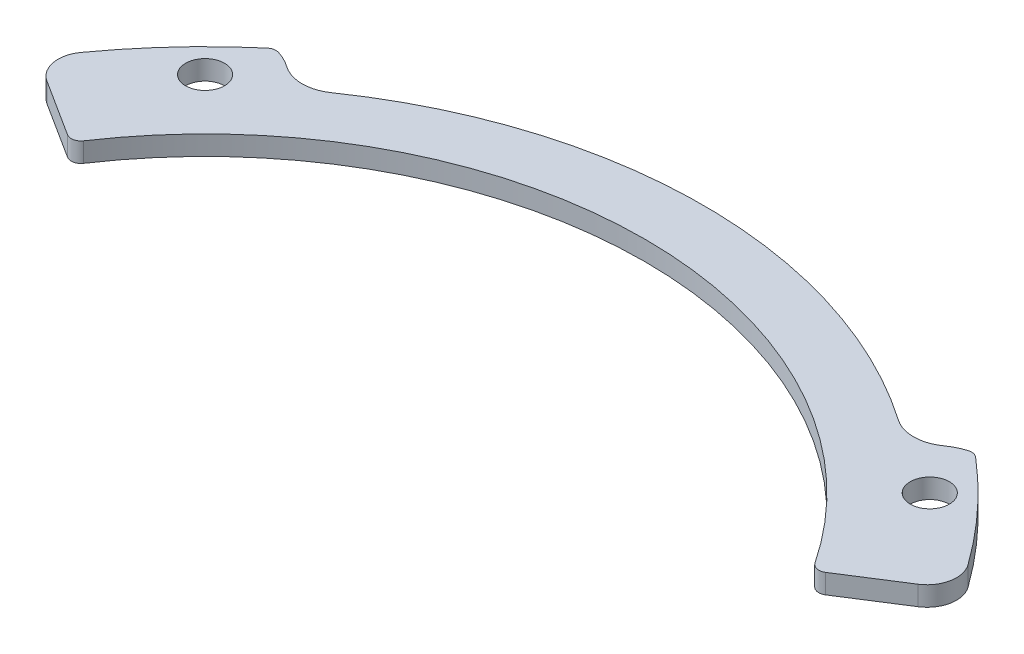
ISO-10303-21;
HEADER;
FILE_DESCRIPTION(('STEP AP214'),'2;1');
FILE_NAME('part.step','',(''),(''),'','','');
FILE_SCHEMA(('AUTOMOTIVE_DESIGN { 1 0 10303 214 1 1 1 1 }'));
ENDSEC;
DATA;
#1=APPLICATION_CONTEXT('core data for automotive mechanical design processes');
#2=APPLICATION_PROTOCOL_DEFINITION('international standard','automotive_design',2000,#1);
#3=PRODUCT_CONTEXT('',#1,'mechanical');
#4=PRODUCT('Part','Part','',(#3));
#5=PRODUCT_RELATED_PRODUCT_CATEGORY('part','',(#4));
#6=PRODUCT_DEFINITION_FORMATION('','',#4);
#7=PRODUCT_DEFINITION_CONTEXT('part definition',#1,'design');
#8=PRODUCT_DEFINITION('design','',#6,#7);
#9=PRODUCT_DEFINITION_SHAPE('','',#8);
#10=(LENGTH_UNIT() NAMED_UNIT(*) SI_UNIT(.MILLI.,.METRE.));
#11=(NAMED_UNIT(*) PLANE_ANGLE_UNIT() SI_UNIT($,.RADIAN.));
#12=(NAMED_UNIT(*) SI_UNIT($,.STERADIAN.) SOLID_ANGLE_UNIT());
#13=UNCERTAINTY_MEASURE_WITH_UNIT(LENGTH_MEASURE(1.E-05),#10,'distance_accuracy_value','');
#14=(GEOMETRIC_REPRESENTATION_CONTEXT(3) GLOBAL_UNCERTAINTY_ASSIGNED_CONTEXT((#13)) GLOBAL_UNIT_ASSIGNED_CONTEXT((#10,
#11,#12)) REPRESENTATION_CONTEXT('',''));
#15=CARTESIAN_POINT('',(0.,0.,0.));
#16=DIRECTION('',(0.,0.,1.));
#17=DIRECTION('',(1.,0.,0.));
#18=AXIS2_PLACEMENT_3D('',#15,#16,#17);
#19=CARTESIAN_POINT('',(0.,2.,0.));
#20=DIRECTION('',(0.,1.,0.));
#21=DIRECTION('',(0.,0.,1.));
#22=AXIS2_PLACEMENT_3D('',#19,#20,#21);
#23=PLANE('',#22);
#24=CARTESIAN_POINT('',(-37.1231060122938,2.,-37.1231060122937));
#25=DIRECTION('',(0.,1.,0.));
#26=DIRECTION('',(0.,0.,1.));
#27=AXIS2_PLACEMENT_3D('',#24,#25,#26);
#28=CIRCLE('',#27,2.);
#29=CARTESIAN_POINT('',(-37.1231060122938,2.,-35.1231060122937));
#30=VERTEX_POINT('',#29);
#31=EDGE_CURVE('E204',#30,#30,#28,.T.);
#32=ORIENTED_EDGE('',*,*,#31,.F.);
#33=EDGE_LOOP('',(#32));
#34=FACE_BOUND('',#33,.T.);
#35=CARTESIAN_POINT('',(37.1231060122937,2.,-37.1231060122937));
#36=DIRECTION('',(0.,1.,0.));
#37=DIRECTION('',(0.,0.,1.));
#38=AXIS2_PLACEMENT_3D('',#35,#36,#37);
#39=CIRCLE('',#38,2.00000000000001);
#40=CARTESIAN_POINT('',(37.1231060122937,2.,-35.1231060122937));
#41=VERTEX_POINT('',#40);
#42=EDGE_CURVE('E210',#41,#41,#39,.T.);
#43=ORIENTED_EDGE('',*,*,#42,.F.);
#44=EDGE_LOOP('',(#43));
#45=FACE_BOUND('',#44,.T.);
#46=CARTESIAN_POINT('',(0.,2.,0.));
#47=DIRECTION('',(0.,-1.,0.));
#48=DIRECTION('',(0.,0.,1.));
#49=AXIS2_PLACEMENT_3D('',#46,#47,#48);
#50=CIRCLE('',#49,45.05);
#51=CARTESIAN_POINT('',(-37.460193224961,2.,-25.0247162531083));
#52=VERTEX_POINT('',#51);
#53=CARTESIAN_POINT('',(37.460193224961,2.,-25.0247162531083));
#54=VERTEX_POINT('',#53);
#55=EDGE_CURVE('E216',#52,#54,#50,.T.);
#56=ORIENTED_EDGE('',*,*,#55,.T.);
#57=CARTESIAN_POINT('',(38.2917180468247,2.,-25.5802038502916));
#58=DIRECTION('',(0.,1.,0.));
#59=DIRECTION('',(0.,0.,1.));
#60=AXIS2_PLACEMENT_3D('',#57,#58,#59);
#61=CIRCLE('',#60,1.);
#62=CARTESIAN_POINT('',(38.8290176551716,2.,-24.7368124044788));
#63=VERTEX_POINT('',#62);
#64=EDGE_CURVE('E277',#54,#63,#61,.T.);
#65=ORIENTED_EDGE('',*,*,#64,.T.);
#66=DIRECTION('',(0.843391445812887,0.,-0.537299608346822));
#67=VECTOR('',#66,1.);
#68=CARTESIAN_POINT('',(37.9947846338706,2.,-24.2053473560243));
#69=LINE('',#68,#67);
#70=CARTESIAN_POINT('',(44.6280804700021,2.,-28.4312228643619));
#71=VERTEX_POINT('',#70);
#72=EDGE_CURVE('E219',#63,#71,#69,.T.);
#73=ORIENTED_EDGE('',*,*,#72,.T.);
#74=CARTESIAN_POINT('',(43.0161816449617,2.,-30.9613972018006));
#75=DIRECTION('',(0.,1.,0.));
#76=DIRECTION('',(0.,0.,1.));
#77=AXIS2_PLACEMENT_3D('',#74,#75,#76);
#78=CIRCLE('',#77,3.00000000000001);
#79=CARTESIAN_POINT('',(45.4510598512803,2.,-32.7139291188836));
#80=VERTEX_POINT('',#79);
#81=EDGE_CURVE('E222',#71,#80,#78,.T.);
#82=ORIENTED_EDGE('',*,*,#81,.T.);
#83=CARTESIAN_POINT('',(0.,2.,0.));
#84=DIRECTION('',(0.,1.,0.));
#85=DIRECTION('',(0.,0.,1.));
#86=AXIS2_PLACEMENT_3D('',#83,#84,#85);
#87=CIRCLE('',#86,56.);
#88=CARTESIAN_POINT('',(36.2811098013673,2.,-42.6577199529128));
#89=VERTEX_POINT('',#88);
#90=EDGE_CURVE('E225',#80,#89,#87,.T.);
#91=ORIENTED_EDGE('',*,*,#90,.T.);
#92=CARTESIAN_POINT('',(35.6332328406286,2.,-41.8959749537536));
#93=DIRECTION('',(0.,1.,0.));
#94=DIRECTION('',(0.,0.,1.));
#95=AXIS2_PLACEMENT_3D('',#92,#93,#94);
#96=CIRCLE('',#95,1.);
#97=CARTESIAN_POINT('',(35.3352582062955,2.,-42.8505487420456));
#98=VERTEX_POINT('',#97);
#99=EDGE_CURVE('E50',#89,#98,#96,.T.);
#100=ORIENTED_EDGE('',*,*,#99,.T.);
#101=CARTESIAN_POINT('',(37.1231060122938,2.,-37.1231060122937));
#102=DIRECTION('',(0.,-1.,0.));
#103=DIRECTION('',(0.,0.,-1.));
#104=AXIS2_PLACEMENT_3D('',#101,#102,#103);
#105=CIRCLE('',#104,6.);
#106=CARTESIAN_POINT('',(33.6433828927082,2.,-42.0110019820359));
#107=VERTEX_POINT('',#106);
#108=EDGE_CURVE('E163',#107,#98,#105,.T.);
#109=ORIENTED_EDGE('',*,*,#108,.F.);
#110=CARTESIAN_POINT('',(31.3235674796512,2.,-45.2695992951974));
#111=DIRECTION('',(0.,1.,0.));
#112=DIRECTION('',(0.,0.,1.));
#113=AXIS2_PLACEMENT_3D('',#110,#111,#112);
#114=CIRCLE('',#113,4.);
#115=CARTESIAN_POINT('',(29.0475589434368,2.,-41.9802551138933));
#116=VERTEX_POINT('',#115);
#117=EDGE_CURVE('E193',#116,#107,#114,.T.);
#118=ORIENTED_EDGE('',*,*,#117,.F.);
#119=CARTESIAN_POINT('',(0.,2.,0.));
#120=DIRECTION('',(0.,-1.,0.));
#121=DIRECTION('',(0.,0.,-1.));
#122=AXIS2_PLACEMENT_3D('',#119,#120,#121);
#123=CIRCLE('',#122,51.05);
#124=CARTESIAN_POINT('',(-29.0475589434368,2.,-41.9802551138933));
#125=VERTEX_POINT('',#124);
#126=EDGE_CURVE('E190',#125,#116,#123,.T.);
#127=ORIENTED_EDGE('',*,*,#126,.F.);
#128=CARTESIAN_POINT('',(-31.3235674796512,2.,-45.2695992951974));
#129=DIRECTION('',(0.,1.,0.));
#130=DIRECTION('',(0.,0.,-1.));
#131=AXIS2_PLACEMENT_3D('',#128,#129,#130);
#132=CIRCLE('',#131,4.);
#133=CARTESIAN_POINT('',(-33.6433828927082,2.,-42.0110019820359));
#134=VERTEX_POINT('',#133);
#135=EDGE_CURVE('E188',#134,#125,#132,.T.);
#136=ORIENTED_EDGE('',*,*,#135,.F.);
#137=CARTESIAN_POINT('',(-37.1231060122938,2.,-37.1231060122937));
#138=DIRECTION('',(0.,-1.,0.));
#139=DIRECTION('',(0.,0.,1.));
#140=AXIS2_PLACEMENT_3D('',#137,#138,#139);
#141=CIRCLE('',#140,6.);
#142=CARTESIAN_POINT('',(-35.3352582062955,2.,-42.8505487420456));
#143=VERTEX_POINT('',#142);
#144=EDGE_CURVE('E169',#143,#134,#141,.T.);
#145=ORIENTED_EDGE('',*,*,#144,.F.);
#146=CARTESIAN_POINT('',(-35.6332328406286,2.,-41.8959749537536));
#147=DIRECTION('',(0.,1.,0.));
#148=DIRECTION('',(0.,0.,1.));
#149=AXIS2_PLACEMENT_3D('',#146,#147,#148);
#150=CIRCLE('',#149,1.);
#151=CARTESIAN_POINT('',(-36.2811098013673,2.,-42.6577199529128));
#152=VERTEX_POINT('',#151);
#153=EDGE_CURVE('E272',#143,#152,#150,.T.);
#154=ORIENTED_EDGE('',*,*,#153,.T.);
#155=CARTESIAN_POINT('',(-45.4510598512803,2.,-32.7139291188836));
#156=VERTEX_POINT('',#155);
#157=EDGE_CURVE('E224',#152,#156,#87,.T.);
#158=ORIENTED_EDGE('',*,*,#157,.T.);
#159=CARTESIAN_POINT('',(-43.0161816449617,2.,-30.9613972018006));
#160=DIRECTION('',(0.,1.,0.));
#161=DIRECTION('',(0.,0.,-1.));
#162=AXIS2_PLACEMENT_3D('',#159,#160,#161);
#163=CIRCLE('',#162,3.00000000000001);
#164=CARTESIAN_POINT('',(-44.6280804700021,2.,-28.4312228643619));
#165=VERTEX_POINT('',#164);
#166=EDGE_CURVE('E228',#156,#165,#163,.T.);
#167=ORIENTED_EDGE('',*,*,#166,.T.);
#168=DIRECTION('',(0.843391445812887,0.,0.537299608346822));
#169=VECTOR('',#168,1.);
#170=CARTESIAN_POINT('',(-37.9947846338706,2.,-24.2053473560243));
#171=LINE('',#170,#169);
#172=CARTESIAN_POINT('',(-38.8290176551716,2.,-24.7368124044788));
#173=VERTEX_POINT('',#172);
#174=EDGE_CURVE('E230',#165,#173,#171,.T.);
#175=ORIENTED_EDGE('',*,*,#174,.T.);
#176=CARTESIAN_POINT('',(-38.2917180468247,2.,-25.5802038502916));
#177=DIRECTION('',(0.,1.,0.));
#178=DIRECTION('',(0.,0.,1.));
#179=AXIS2_PLACEMENT_3D('',#176,#177,#178);
#180=CIRCLE('',#179,1.);
#181=EDGE_CURVE('E275',#173,#52,#180,.T.);
#182=ORIENTED_EDGE('',*,*,#181,.T.);
#183=EDGE_LOOP('',(#56,#65,#73,#82,#91,#100,#109,#118,#127,#136,#145,#154,#158,#167,#175,#182));
#184=FACE_BOUND('',#183,.T.);
#185=ADVANCED_FACE('F35',(#34,#45,#184),#23,.T.);
#186=CARTESIAN_POINT('',(0.,0.,0.));
#187=DIRECTION('',(0.,1.,0.));
#188=DIRECTION('',(0.,0.,1.));
#189=AXIS2_PLACEMENT_3D('',#186,#187,#188);
#190=PLANE('',#189);
#191=CARTESIAN_POINT('',(37.1231060122937,0.,-37.1231060122937));
#192=DIRECTION('',(0.,1.,0.));
#193=DIRECTION('',(0.,0.,1.));
#194=AXIS2_PLACEMENT_3D('',#191,#192,#193);
#195=CIRCLE('',#194,2.00000000000001);
#196=CARTESIAN_POINT('',(37.1231060122937,0.,-35.1231060122937));
#197=VERTEX_POINT('',#196);
#198=EDGE_CURVE('E207',#197,#197,#195,.T.);
#199=ORIENTED_EDGE('',*,*,#198,.T.);
#200=EDGE_LOOP('',(#199));
#201=FACE_BOUND('',#200,.T.);
#202=CARTESIAN_POINT('',(-37.1231060122938,0.,-37.1231060122937));
#203=DIRECTION('',(0.,1.,0.));
#204=DIRECTION('',(0.,0.,1.));
#205=AXIS2_PLACEMENT_3D('',#202,#203,#204);
#206=CIRCLE('',#205,2.);
#207=CARTESIAN_POINT('',(-37.1231060122938,0.,-35.1231060122937));
#208=VERTEX_POINT('',#207);
#209=EDGE_CURVE('E200',#208,#208,#206,.T.);
#210=ORIENTED_EDGE('',*,*,#209,.T.);
#211=EDGE_LOOP('',(#210));
#212=FACE_BOUND('',#211,.T.);
#213=DIRECTION('',(0.843391445812887,0.,-0.537299608346822));
#214=VECTOR('',#213,1.);
#215=CARTESIAN_POINT('',(37.9947846338706,0.,-24.2053473560243));
#216=LINE('',#215,#214);
#217=CARTESIAN_POINT('',(38.8290176551716,0.,-24.7368124044788));
#218=VERTEX_POINT('',#217);
#219=CARTESIAN_POINT('',(44.6280804700021,0.,-28.4312228643619));
#220=VERTEX_POINT('',#219);
#221=EDGE_CURVE('E235',#218,#220,#216,.T.);
#222=ORIENTED_EDGE('',*,*,#221,.F.);
#223=CARTESIAN_POINT('',(38.2917180468247,0.,-25.5802038502916));
#224=DIRECTION('',(0.,1.,0.));
#225=DIRECTION('',(0.,0.,1.));
#226=AXIS2_PLACEMENT_3D('',#223,#224,#225);
#227=CIRCLE('',#226,1.);
#228=CARTESIAN_POINT('',(37.460193224961,0.,-25.0247162531083));
#229=VERTEX_POINT('',#228);
#230=EDGE_CURVE('E265',#218,#229,#227,.F.);
#231=ORIENTED_EDGE('',*,*,#230,.T.);
#232=CARTESIAN_POINT('',(0.,0.,0.));
#233=DIRECTION('',(0.,-1.,0.));
#234=DIRECTION('',(0.,0.,1.));
#235=AXIS2_PLACEMENT_3D('',#232,#233,#234);
#236=CIRCLE('',#235,45.05);
#237=CARTESIAN_POINT('',(-37.460193224961,0.,-25.0247162531083));
#238=VERTEX_POINT('',#237);
#239=EDGE_CURVE('E213',#238,#229,#236,.T.);
#240=ORIENTED_EDGE('',*,*,#239,.F.);
#241=CARTESIAN_POINT('',(-38.2917180468247,0.,-25.5802038502916));
#242=DIRECTION('',(0.,1.,0.));
#243=DIRECTION('',(0.,0.,1.));
#244=AXIS2_PLACEMENT_3D('',#241,#242,#243);
#245=CIRCLE('',#244,1.);
#246=CARTESIAN_POINT('',(-38.8290176551716,0.,-24.7368124044788));
#247=VERTEX_POINT('',#246);
#248=EDGE_CURVE('E263',#238,#247,#245,.F.);
#249=ORIENTED_EDGE('',*,*,#248,.T.);
#250=DIRECTION('',(0.843391445812887,0.,0.537299608346822));
#251=VECTOR('',#250,1.);
#252=CARTESIAN_POINT('',(-37.9947846338706,0.,-24.2053473560243));
#253=LINE('',#252,#251);
#254=CARTESIAN_POINT('',(-44.6280804700021,0.,-28.4312228643619));
#255=VERTEX_POINT('',#254);
#256=EDGE_CURVE('E220',#255,#247,#253,.T.);
#257=ORIENTED_EDGE('',*,*,#256,.F.);
#258=CARTESIAN_POINT('',(-43.0161816449617,0.,-30.9613972018006));
#259=DIRECTION('',(0.,1.,0.));
#260=DIRECTION('',(0.,0.,-1.));
#261=AXIS2_PLACEMENT_3D('',#258,#259,#260);
#262=CIRCLE('',#261,3.00000000000001);
#263=CARTESIAN_POINT('',(-45.4510598512803,0.,-32.7139291188836));
#264=VERTEX_POINT('',#263);
#265=EDGE_CURVE('E243',#264,#255,#262,.T.);
#266=ORIENTED_EDGE('',*,*,#265,.F.);
#267=CARTESIAN_POINT('',(0.,0.,0.));
#268=DIRECTION('',(0.,1.,0.));
#269=DIRECTION('',(0.,0.,1.));
#270=AXIS2_PLACEMENT_3D('',#267,#268,#269);
#271=CIRCLE('',#270,56.);
#272=CARTESIAN_POINT('',(-36.2811098013673,0.,-42.6577199529128));
#273=VERTEX_POINT('',#272);
#274=EDGE_CURVE('E239',#273,#264,#271,.T.);
#275=ORIENTED_EDGE('',*,*,#274,.F.);
#276=CARTESIAN_POINT('',(-35.6332328406286,0.,-41.8959749537536));
#277=DIRECTION('',(0.,1.,0.));
#278=DIRECTION('',(0.,0.,1.));
#279=AXIS2_PLACEMENT_3D('',#276,#277,#278);
#280=CIRCLE('',#279,1.);
#281=CARTESIAN_POINT('',(-35.3352582062955,0.,-42.8505487420456));
#282=VERTEX_POINT('',#281);
#283=EDGE_CURVE('E159',#273,#282,#280,.F.);
#284=ORIENTED_EDGE('',*,*,#283,.T.);
#285=CARTESIAN_POINT('',(-37.1231060122938,0.,-37.1231060122937));
#286=DIRECTION('',(0.,-1.,0.));
#287=DIRECTION('',(0.,0.,1.));
#288=AXIS2_PLACEMENT_3D('',#285,#286,#287);
#289=CIRCLE('',#288,6.);
#290=CARTESIAN_POINT('',(-33.6433828927082,0.,-42.0110019820359));
#291=VERTEX_POINT('',#290);
#292=EDGE_CURVE('E150',#282,#291,#289,.T.);
#293=ORIENTED_EDGE('',*,*,#292,.T.);
#294=CARTESIAN_POINT('',(-31.3235674796512,0.,-45.2695992951974));
#295=DIRECTION('',(0.,1.,0.));
#296=DIRECTION('',(0.,0.,-1.));
#297=AXIS2_PLACEMENT_3D('',#294,#295,#296);
#298=CIRCLE('',#297,4.);
#299=CARTESIAN_POINT('',(-29.0475589434368,0.,-41.9802551138933));
#300=VERTEX_POINT('',#299);
#301=EDGE_CURVE('E156',#291,#300,#298,.T.);
#302=ORIENTED_EDGE('',*,*,#301,.T.);
#303=CARTESIAN_POINT('',(0.,0.,0.));
#304=DIRECTION('',(0.,-1.,0.));
#305=DIRECTION('',(0.,0.,-1.));
#306=AXIS2_PLACEMENT_3D('',#303,#304,#305);
#307=CIRCLE('',#306,51.05);
#308=CARTESIAN_POINT('',(29.0475589434368,0.,-41.9802551138933));
#309=VERTEX_POINT('',#308);
#310=EDGE_CURVE('E178',#300,#309,#307,.T.);
#311=ORIENTED_EDGE('',*,*,#310,.T.);
#312=CARTESIAN_POINT('',(31.3235674796512,0.,-45.2695992951974));
#313=DIRECTION('',(0.,1.,0.));
#314=DIRECTION('',(0.,0.,1.));
#315=AXIS2_PLACEMENT_3D('',#312,#313,#314);
#316=CIRCLE('',#315,4.);
#317=CARTESIAN_POINT('',(33.6433828927082,0.,-42.0110019820359));
#318=VERTEX_POINT('',#317);
#319=EDGE_CURVE('E180',#309,#318,#316,.T.);
#320=ORIENTED_EDGE('',*,*,#319,.T.);
#321=CARTESIAN_POINT('',(37.1231060122938,0.,-37.1231060122937));
#322=DIRECTION('',(0.,-1.,0.));
#323=DIRECTION('',(0.,0.,-1.));
#324=AXIS2_PLACEMENT_3D('',#321,#322,#323);
#325=CIRCLE('',#324,6.);
#326=CARTESIAN_POINT('',(35.3352582062955,0.,-42.8505487420456));
#327=VERTEX_POINT('',#326);
#328=EDGE_CURVE('E174',#318,#327,#325,.T.);
#329=ORIENTED_EDGE('',*,*,#328,.T.);
#330=CARTESIAN_POINT('',(35.6332328406286,0.,-41.8959749537536));
#331=DIRECTION('',(0.,1.,0.));
#332=DIRECTION('',(0.,0.,1.));
#333=AXIS2_PLACEMENT_3D('',#330,#331,#332);
#334=CIRCLE('',#333,1.);
#335=CARTESIAN_POINT('',(36.2811098013673,0.,-42.6577199529128));
#336=VERTEX_POINT('',#335);
#337=EDGE_CURVE('E261',#327,#336,#334,.F.);
#338=ORIENTED_EDGE('',*,*,#337,.T.);
#339=CARTESIAN_POINT('',(45.4510598512803,0.,-32.7139291188836));
#340=VERTEX_POINT('',#339);
#341=EDGE_CURVE('E240',#340,#336,#271,.T.);
#342=ORIENTED_EDGE('',*,*,#341,.F.);
#343=CARTESIAN_POINT('',(43.0161816449617,0.,-30.9613972018006));
#344=DIRECTION('',(0.,1.,0.));
#345=DIRECTION('',(0.,0.,1.));
#346=AXIS2_PLACEMENT_3D('',#343,#344,#345);
#347=CIRCLE('',#346,3.00000000000001);
#348=EDGE_CURVE('E237',#220,#340,#347,.T.);
#349=ORIENTED_EDGE('',*,*,#348,.F.);
#350=EDGE_LOOP('',(#222,#231,#240,#249,#257,#266,#275,#284,#293,#302,#311,#320,#329,#338,#342,#349));
#351=FACE_BOUND('',#350,.T.);
#352=ADVANCED_FACE('F153',(#201,#212,#351),#190,.F.);
#353=CARTESIAN_POINT('',(0.,2.,0.));
#354=DIRECTION('',(0.,-1.,0.));
#355=DIRECTION('',(0.,0.,-1.));
#356=AXIS2_PLACEMENT_3D('',#353,#354,#355);
#357=CYLINDRICAL_SURFACE('',#356,56.);
#358=ORIENTED_EDGE('',*,*,#341,.T.);
#359=DIRECTION('',(0.,-1.,0.));
#360=VECTOR('',#359,1.);
#361=CARTESIAN_POINT('',(36.2811098013673,2.,-42.6577199529128));
#362=LINE('',#361,#360);
#363=EDGE_CURVE('E280',#336,#89,#362,.F.);
#364=ORIENTED_EDGE('',*,*,#363,.T.);
#365=ORIENTED_EDGE('',*,*,#90,.F.);
#366=DIRECTION('',(0.,-1.,0.));
#367=VECTOR('',#366,1.);
#368=CARTESIAN_POINT('',(45.4510598512803,2.,-32.7139291188836));
#369=LINE('',#368,#367);
#370=EDGE_CURVE('E251',#80,#340,#369,.T.);
#371=ORIENTED_EDGE('',*,*,#370,.T.);
#372=EDGE_LOOP('',(#358,#364,#365,#371));
#373=FACE_BOUND('',#372,.T.);
#374=ADVANCED_FACE('F302',(#373),#357,.T.);
#375=CARTESIAN_POINT('',(0.,2.,0.));
#376=DIRECTION('',(0.,-1.,0.));
#377=DIRECTION('',(0.,0.,-1.));
#378=AXIS2_PLACEMENT_3D('',#375,#376,#377);
#379=CYLINDRICAL_SURFACE('',#378,45.05);
#380=ORIENTED_EDGE('',*,*,#239,.T.);
#381=DIRECTION('',(0.,-1.,0.));
#382=VECTOR('',#381,1.);
#383=CARTESIAN_POINT('',(37.460193224961,2.,-25.0247162531083));
#384=LINE('',#383,#382);
#385=EDGE_CURVE('E270',#229,#54,#384,.F.);
#386=ORIENTED_EDGE('',*,*,#385,.T.);
#387=ORIENTED_EDGE('',*,*,#55,.F.);
#388=DIRECTION('',(0.,-1.,0.));
#389=VECTOR('',#388,1.);
#390=CARTESIAN_POINT('',(-37.460193224961,2.,-25.0247162531083));
#391=LINE('',#390,#389);
#392=EDGE_CURVE('E267',#52,#238,#391,.T.);
#393=ORIENTED_EDGE('',*,*,#392,.T.);
#394=EDGE_LOOP('',(#380,#386,#387,#393));
#395=FACE_BOUND('',#394,.T.);
#396=ADVANCED_FACE('F320',(#395),#379,.F.);
#397=CARTESIAN_POINT('',(37.9947846338706,2.,-24.2053473560243));
#398=DIRECTION('',(-0.537299608346822,0.,-0.843391445812887));
#399=DIRECTION('',(-0.843391445812887,0.,0.537299608346822));
#400=AXIS2_PLACEMENT_3D('',#397,#398,#399);
#401=PLANE('',#400);
#402=ORIENTED_EDGE('',*,*,#72,.F.);
#403=DIRECTION('',(0.,-1.,0.));
#404=VECTOR('',#403,1.);
#405=CARTESIAN_POINT('',(38.8290176551716,2.,-24.7368124044788));
#406=LINE('',#405,#404);
#407=EDGE_CURVE('E257',#63,#218,#406,.T.);
#408=ORIENTED_EDGE('',*,*,#407,.T.);
#409=ORIENTED_EDGE('',*,*,#221,.T.);
#410=DIRECTION('',(0.,-1.,0.));
#411=VECTOR('',#410,1.);
#412=CARTESIAN_POINT('',(44.6280804700021,2.,-28.4312228643619));
#413=LINE('',#412,#411);
#414=EDGE_CURVE('E254',#71,#220,#413,.T.);
#415=ORIENTED_EDGE('',*,*,#414,.F.);
#416=EDGE_LOOP('',(#402,#408,#409,#415));
#417=FACE_BOUND('',#416,.T.);
#418=ADVANCED_FACE('F312',(#417),#401,.F.);
#419=CARTESIAN_POINT('',(43.0161816449617,2.,-30.9613972018006));
#420=DIRECTION('',(0.,-1.,0.));
#421=DIRECTION('',(0.,0.,-1.));
#422=AXIS2_PLACEMENT_3D('',#419,#420,#421);
#423=CYLINDRICAL_SURFACE('',#422,3.00000000000001);
#424=ORIENTED_EDGE('',*,*,#348,.T.);
#425=ORIENTED_EDGE('',*,*,#370,.F.);
#426=ORIENTED_EDGE('',*,*,#81,.F.);
#427=ORIENTED_EDGE('',*,*,#414,.T.);
#428=EDGE_LOOP('',(#424,#425,#426,#427));
#429=FACE_BOUND('',#428,.T.);
#430=ADVANCED_FACE('F307',(#429),#423,.T.);
#431=ORIENTED_EDGE('',*,*,#157,.F.);
#432=DIRECTION('',(0.,-1.,0.));
#433=VECTOR('',#432,1.);
#434=CARTESIAN_POINT('',(-36.2811098013673,2.,-42.6577199529128));
#435=LINE('',#434,#433);
#436=EDGE_CURVE('E11',#152,#273,#435,.T.);
#437=ORIENTED_EDGE('',*,*,#436,.T.);
#438=ORIENTED_EDGE('',*,*,#274,.T.);
#439=DIRECTION('',(0.,-1.,0.));
#440=VECTOR('',#439,1.);
#441=CARTESIAN_POINT('',(-45.4510598512803,2.,-32.7139291188836));
#442=LINE('',#441,#440);
#443=EDGE_CURVE('E248',#156,#264,#442,.T.);
#444=ORIENTED_EDGE('',*,*,#443,.F.);
#445=EDGE_LOOP('',(#431,#437,#438,#444));
#446=FACE_BOUND('',#445,.T.);
#447=ADVANCED_FACE('F335',(#446),#357,.T.);
#448=CARTESIAN_POINT('',(-43.0161816449617,2.,-30.9613972018006));
#449=DIRECTION('',(0.,-1.,0.));
#450=DIRECTION('',(0.,0.,-1.));
#451=AXIS2_PLACEMENT_3D('',#448,#449,#450);
#452=CYLINDRICAL_SURFACE('',#451,3.00000000000001);
#453=ORIENTED_EDGE('',*,*,#265,.T.);
#454=DIRECTION('',(0.,-1.,0.));
#455=VECTOR('',#454,1.);
#456=CARTESIAN_POINT('',(-44.6280804700021,2.,-28.4312228643619));
#457=LINE('',#456,#455);
#458=EDGE_CURVE('E232',#165,#255,#457,.T.);
#459=ORIENTED_EDGE('',*,*,#458,.F.);
#460=ORIENTED_EDGE('',*,*,#166,.F.);
#461=ORIENTED_EDGE('',*,*,#443,.T.);
#462=EDGE_LOOP('',(#453,#459,#460,#461));
#463=FACE_BOUND('',#462,.T.);
#464=ADVANCED_FACE('F331',(#463),#452,.T.);
#465=CARTESIAN_POINT('',(-37.9947846338706,2.,-24.2053473560243));
#466=DIRECTION('',(0.537299608346822,0.,-0.843391445812887));
#467=DIRECTION('',(-0.843391445812887,0.,-0.537299608346822));
#468=AXIS2_PLACEMENT_3D('',#465,#466,#467);
#469=PLANE('',#468);
#470=ORIENTED_EDGE('',*,*,#256,.T.);
#471=DIRECTION('',(0.,-1.,0.));
#472=VECTOR('',#471,1.);
#473=CARTESIAN_POINT('',(-38.8290176551716,2.,-24.7368124044788));
#474=LINE('',#473,#472);
#475=EDGE_CURVE('E58',#247,#173,#474,.F.);
#476=ORIENTED_EDGE('',*,*,#475,.T.);
#477=ORIENTED_EDGE('',*,*,#174,.F.);
#478=ORIENTED_EDGE('',*,*,#458,.T.);
#479=EDGE_LOOP('',(#470,#476,#477,#478));
#480=FACE_BOUND('',#479,.T.);
#481=ADVANCED_FACE('F327',(#480),#469,.F.);
#482=CARTESIAN_POINT('',(37.1231060122937,2.,-37.1231060122937));
#483=DIRECTION('',(0.,-1.,0.));
#484=DIRECTION('',(0.,0.,-1.));
#485=AXIS2_PLACEMENT_3D('',#482,#483,#484);
#486=CYLINDRICAL_SURFACE('',#485,2.00000000000001);
#487=ORIENTED_EDGE('',*,*,#42,.T.);
#488=EDGE_LOOP('',(#487));
#489=FACE_BOUND('',#488,.T.);
#490=ORIENTED_EDGE('',*,*,#198,.F.);
#491=EDGE_LOOP('',(#490));
#492=FACE_BOUND('',#491,.T.);
#493=ADVANCED_FACE('F356',(#489,#492),#486,.F.);
#494=CARTESIAN_POINT('',(-37.1231060122938,2.,-37.1231060122937));
#495=DIRECTION('',(0.,-1.,0.));
#496=DIRECTION('',(0.,0.,-1.));
#497=AXIS2_PLACEMENT_3D('',#494,#495,#496);
#498=CYLINDRICAL_SURFACE('',#497,2.);
#499=ORIENTED_EDGE('',*,*,#31,.T.);
#500=EDGE_LOOP('',(#499));
#501=FACE_BOUND('',#500,.T.);
#502=ORIENTED_EDGE('',*,*,#209,.F.);
#503=EDGE_LOOP('',(#502));
#504=FACE_BOUND('',#503,.T.);
#505=ADVANCED_FACE('F363',(#501,#504),#498,.F.);
#506=CARTESIAN_POINT('',(37.1231060122938,0.,-37.1231060122937));
#507=DIRECTION('',(0.,1.,0.));
#508=DIRECTION('',(0.,0.,1.));
#509=AXIS2_PLACEMENT_3D('',#506,#507,#508);
#510=CYLINDRICAL_SURFACE('',#509,6.);
#511=ORIENTED_EDGE('',*,*,#108,.T.);
#512=DIRECTION('',(0.,1.,0.));
#513=VECTOR('',#512,1.);
#514=CARTESIAN_POINT('',(35.3352582062955,0.,-42.8505487420456));
#515=LINE('',#514,#513);
#516=EDGE_CURVE('E282',#98,#327,#515,.F.);
#517=ORIENTED_EDGE('',*,*,#516,.T.);
#518=ORIENTED_EDGE('',*,*,#328,.F.);
#519=DIRECTION('',(0.,1.,0.));
#520=VECTOR('',#519,1.);
#521=CARTESIAN_POINT('',(33.6433828927082,0.,-42.0110019820359));
#522=LINE('',#521,#520);
#523=EDGE_CURVE('E198',#318,#107,#522,.T.);
#524=ORIENTED_EDGE('',*,*,#523,.T.);
#525=EDGE_LOOP('',(#511,#517,#518,#524));
#526=FACE_BOUND('',#525,.T.);
#527=ADVANCED_FACE('F297',(#526),#510,.T.);
#528=CARTESIAN_POINT('',(31.3235674796512,0.,-45.2695992951974));
#529=DIRECTION('',(0.,1.,0.));
#530=DIRECTION('',(0.,0.,1.));
#531=AXIS2_PLACEMENT_3D('',#528,#529,#530);
#532=CYLINDRICAL_SURFACE('',#531,4.);
#533=ORIENTED_EDGE('',*,*,#117,.T.);
#534=ORIENTED_EDGE('',*,*,#523,.F.);
#535=ORIENTED_EDGE('',*,*,#319,.F.);
#536=DIRECTION('',(0.,1.,0.));
#537=VECTOR('',#536,1.);
#538=CARTESIAN_POINT('',(29.0475589434368,0.,-41.9802551138933));
#539=LINE('',#538,#537);
#540=EDGE_CURVE('E201',#309,#116,#539,.T.);
#541=ORIENTED_EDGE('',*,*,#540,.T.);
#542=EDGE_LOOP('',(#533,#534,#535,#541));
#543=FACE_BOUND('',#542,.T.);
#544=ADVANCED_FACE('F295',(#543),#532,.F.);
#545=CARTESIAN_POINT('',(0.,0.,0.));
#546=DIRECTION('',(0.,1.,0.));
#547=DIRECTION('',(0.,0.,1.));
#548=AXIS2_PLACEMENT_3D('',#545,#546,#547);
#549=CYLINDRICAL_SURFACE('',#548,51.05);
#550=ORIENTED_EDGE('',*,*,#126,.T.);
#551=ORIENTED_EDGE('',*,*,#540,.F.);
#552=ORIENTED_EDGE('',*,*,#310,.F.);
#553=DIRECTION('',(0.,1.,0.));
#554=VECTOR('',#553,1.);
#555=CARTESIAN_POINT('',(-29.0475589434368,0.,-41.9802551138933));
#556=LINE('',#555,#554);
#557=EDGE_CURVE('E173',#300,#125,#556,.T.);
#558=ORIENTED_EDGE('',*,*,#557,.T.);
#559=EDGE_LOOP('',(#550,#551,#552,#558));
#560=FACE_BOUND('',#559,.T.);
#561=ADVANCED_FACE('F290',(#560),#549,.T.);
#562=CARTESIAN_POINT('',(-31.3235674796512,0.,-45.2695992951974));
#563=DIRECTION('',(0.,1.,0.));
#564=DIRECTION('',(0.,0.,1.));
#565=AXIS2_PLACEMENT_3D('',#562,#563,#564);
#566=CYLINDRICAL_SURFACE('',#565,4.);
#567=ORIENTED_EDGE('',*,*,#135,.T.);
#568=ORIENTED_EDGE('',*,*,#557,.F.);
#569=ORIENTED_EDGE('',*,*,#301,.F.);
#570=DIRECTION('',(0.,1.,0.));
#571=VECTOR('',#570,1.);
#572=CARTESIAN_POINT('',(-33.6433828927082,0.,-42.0110019820359));
#573=LINE('',#572,#571);
#574=EDGE_CURVE('E166',#291,#134,#573,.T.);
#575=ORIENTED_EDGE('',*,*,#574,.T.);
#576=EDGE_LOOP('',(#567,#568,#569,#575));
#577=FACE_BOUND('',#576,.T.);
#578=ADVANCED_FACE('F176',(#577),#566,.F.);
#579=CARTESIAN_POINT('',(-37.1231060122938,0.,-37.1231060122937));
#580=DIRECTION('',(0.,1.,0.));
#581=DIRECTION('',(0.,0.,1.));
#582=AXIS2_PLACEMENT_3D('',#579,#580,#581);
#583=CYLINDRICAL_SURFACE('',#582,6.);
#584=ORIENTED_EDGE('',*,*,#292,.F.);
#585=DIRECTION('',(0.,1.,0.));
#586=VECTOR('',#585,1.);
#587=CARTESIAN_POINT('',(-35.3352582062955,0.,-42.8505487420456));
#588=LINE('',#587,#586);
#589=EDGE_CURVE('E43',#282,#143,#588,.T.);
#590=ORIENTED_EDGE('',*,*,#589,.T.);
#591=ORIENTED_EDGE('',*,*,#144,.T.);
#592=ORIENTED_EDGE('',*,*,#574,.F.);
#593=EDGE_LOOP('',(#584,#590,#591,#592));
#594=FACE_BOUND('',#593,.T.);
#595=ADVANCED_FACE('F167',(#594),#583,.T.);
#596=CARTESIAN_POINT('',(38.2917180468247,2.,-25.5802038502916));
#597=DIRECTION('',(0.,-1.,0.));
#598=DIRECTION('',(0.,0.,-1.));
#599=AXIS2_PLACEMENT_3D('',#596,#597,#598);
#600=CYLINDRICAL_SURFACE('',#599,1.);
#601=ORIENTED_EDGE('',*,*,#64,.F.);
#602=ORIENTED_EDGE('',*,*,#385,.F.);
#603=ORIENTED_EDGE('',*,*,#230,.F.);
#604=ORIENTED_EDGE('',*,*,#407,.F.);
#605=EDGE_LOOP('',(#601,#602,#603,#604));
#606=FACE_BOUND('',#605,.T.);
#607=ADVANCED_FACE('F316',(#606),#600,.T.);
#608=CARTESIAN_POINT('',(-38.2917180468247,2.,-25.5802038502916));
#609=DIRECTION('',(0.,-1.,0.));
#610=DIRECTION('',(0.,0.,-1.));
#611=AXIS2_PLACEMENT_3D('',#608,#609,#610);
#612=CYLINDRICAL_SURFACE('',#611,1.);
#613=ORIENTED_EDGE('',*,*,#181,.F.);
#614=ORIENTED_EDGE('',*,*,#475,.F.);
#615=ORIENTED_EDGE('',*,*,#248,.F.);
#616=ORIENTED_EDGE('',*,*,#392,.F.);
#617=EDGE_LOOP('',(#613,#614,#615,#616));
#618=FACE_BOUND('',#617,.T.);
#619=ADVANCED_FACE('F324',(#618),#612,.T.);
#620=CARTESIAN_POINT('',(35.6332328406286,0.,-41.8959749537536));
#621=DIRECTION('',(0.,1.,0.));
#622=DIRECTION('',(0.,0.,1.));
#623=AXIS2_PLACEMENT_3D('',#620,#621,#622);
#624=CYLINDRICAL_SURFACE('',#623,1.);
#625=ORIENTED_EDGE('',*,*,#337,.F.);
#626=ORIENTED_EDGE('',*,*,#516,.F.);
#627=ORIENTED_EDGE('',*,*,#99,.F.);
#628=ORIENTED_EDGE('',*,*,#363,.F.);
#629=EDGE_LOOP('',(#625,#626,#627,#628));
#630=FACE_BOUND('',#629,.T.);
#631=ADVANCED_FACE('F298',(#630),#624,.T.);
#632=CARTESIAN_POINT('',(-35.6332328406286,2.,-41.8959749537536));
#633=DIRECTION('',(0.,1.,0.));
#634=DIRECTION('',(0.,0.,1.));
#635=AXIS2_PLACEMENT_3D('',#632,#633,#634);
#636=CYLINDRICAL_SURFACE('',#635,1.);
#637=ORIENTED_EDGE('',*,*,#283,.F.);
#638=ORIENTED_EDGE('',*,*,#436,.F.);
#639=ORIENTED_EDGE('',*,*,#153,.F.);
#640=ORIENTED_EDGE('',*,*,#589,.F.);
#641=EDGE_LOOP('',(#637,#638,#639,#640));
#642=FACE_BOUND('',#641,.T.);
#643=ADVANCED_FACE('F37',(#642),#636,.T.);
#644=CLOSED_SHELL('',(#185,#352,#374,#396,#418,#430,#447,#464,#481,#493,#505,#527,#544,#561,
#578,#595,#607,#619,#631,#643));
#645=MANIFOLD_SOLID_BREP('B2',#644);
#646=ADVANCED_BREP_SHAPE_REPRESENTATION('',(#18,#645),#14);
#647=SHAPE_DEFINITION_REPRESENTATION(#9,#646);
ENDSEC;
END-ISO-10303-21;
